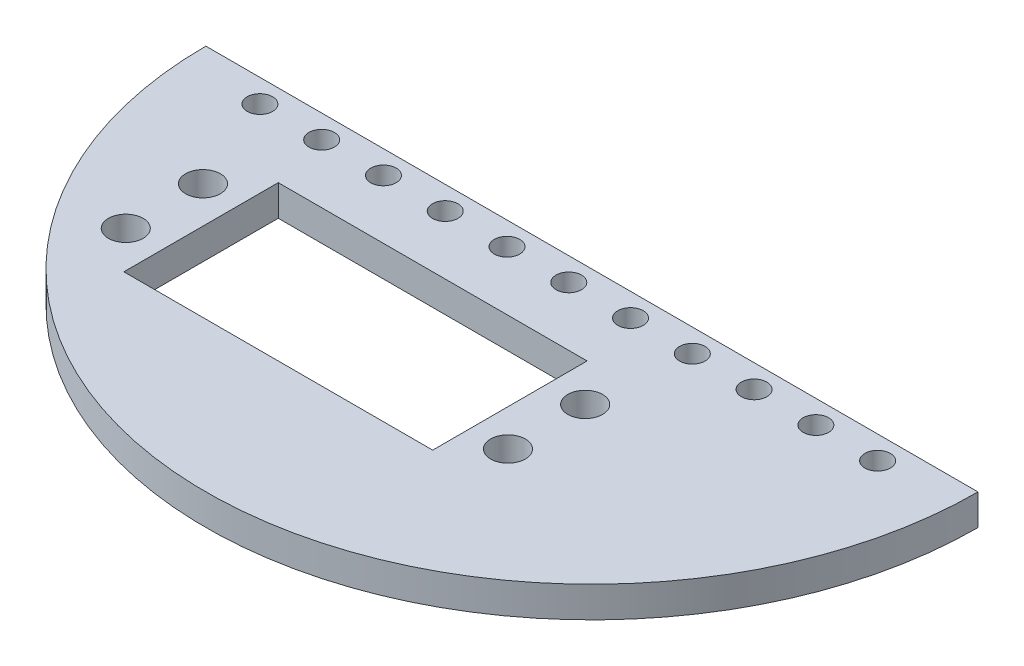
ISO-10303-21;
HEADER;
FILE_DESCRIPTION(('STEP AP214'),'2;1');
FILE_NAME('part.step','',(''),(''),'','','');
FILE_SCHEMA(('AUTOMOTIVE_DESIGN { 1 0 10303 214 1 1 1 1 }'));
ENDSEC;
DATA;
#1=APPLICATION_CONTEXT('core data for automotive mechanical design processes');
#2=APPLICATION_PROTOCOL_DEFINITION('international standard','automotive_design',2000,#1);
#3=PRODUCT_CONTEXT('',#1,'mechanical');
#4=PRODUCT('Part','Part','',(#3));
#5=PRODUCT_RELATED_PRODUCT_CATEGORY('part','',(#4));
#6=PRODUCT_DEFINITION_FORMATION('','',#4);
#7=PRODUCT_DEFINITION_CONTEXT('part definition',#1,'design');
#8=PRODUCT_DEFINITION('design','',#6,#7);
#9=PRODUCT_DEFINITION_SHAPE('','',#8);
#10=(LENGTH_UNIT() NAMED_UNIT(*) SI_UNIT(.MILLI.,.METRE.));
#11=(NAMED_UNIT(*) PLANE_ANGLE_UNIT() SI_UNIT($,.RADIAN.));
#12=(NAMED_UNIT(*) SI_UNIT($,.STERADIAN.) SOLID_ANGLE_UNIT());
#13=UNCERTAINTY_MEASURE_WITH_UNIT(LENGTH_MEASURE(1.E-05),#10,'distance_accuracy_value','');
#14=(GEOMETRIC_REPRESENTATION_CONTEXT(3) GLOBAL_UNCERTAINTY_ASSIGNED_CONTEXT((#13)) GLOBAL_UNIT_ASSIGNED_CONTEXT((#10,
#11,#12)) REPRESENTATION_CONTEXT('',''));
#15=CARTESIAN_POINT('',(0.,0.,0.));
#16=DIRECTION('',(0.,0.,1.));
#17=DIRECTION('',(1.,0.,0.));
#18=AXIS2_PLACEMENT_3D('',#15,#16,#17);
#19=CARTESIAN_POINT('',(0.,4.,0.));
#20=DIRECTION('',(0.,-1.,0.));
#21=DIRECTION('',(0.,0.,-1.));
#22=AXIS2_PLACEMENT_3D('',#19,#20,#21);
#23=CYLINDRICAL_SURFACE('',#22,50.);
#24=CARTESIAN_POINT('',(0.,0.,0.));
#25=DIRECTION('',(0.,1.,0.));
#26=DIRECTION('',(0.,0.,-1.));
#27=AXIS2_PLACEMENT_3D('',#24,#25,#26);
#28=CIRCLE('',#27,50.);
#29=CARTESIAN_POINT('',(-50.,0.,0.));
#30=VERTEX_POINT('',#29);
#31=CARTESIAN_POINT('',(50.,0.,0.));
#32=VERTEX_POINT('',#31);
#33=EDGE_CURVE('E126',#30,#32,#28,.T.);
#34=ORIENTED_EDGE('',*,*,#33,.T.);
#35=DIRECTION('',(0.,-1.,0.));
#36=VECTOR('',#35,1.);
#37=CARTESIAN_POINT('',(50.,4.,0.));
#38=LINE('',#37,#36);
#39=CARTESIAN_POINT('',(50.,4.,0.));
#40=VERTEX_POINT('',#39);
#41=EDGE_CURVE('E148',#40,#32,#38,.T.);
#42=ORIENTED_EDGE('',*,*,#41,.F.);
#43=CARTESIAN_POINT('',(0.,4.,0.));
#44=DIRECTION('',(0.,1.,0.));
#45=DIRECTION('',(0.,0.,-1.));
#46=AXIS2_PLACEMENT_3D('',#43,#44,#45);
#47=CIRCLE('',#46,50.);
#48=CARTESIAN_POINT('',(-50.,4.,0.));
#49=VERTEX_POINT('',#48);
#50=EDGE_CURVE('E131',#49,#40,#47,.T.);
#51=ORIENTED_EDGE('',*,*,#50,.F.);
#52=DIRECTION('',(0.,-1.,0.));
#53=VECTOR('',#52,1.);
#54=CARTESIAN_POINT('',(-50.,4.,0.));
#55=LINE('',#54,#53);
#56=EDGE_CURVE('E139',#49,#30,#55,.T.);
#57=ORIENTED_EDGE('',*,*,#56,.T.);
#58=EDGE_LOOP('',(#34,#42,#51,#57));
#59=FACE_BOUND('',#58,.T.);
#60=ADVANCED_FACE('F38',(#59),#23,.T.);
#61=CARTESIAN_POINT('',(-50.,4.,0.));
#62=DIRECTION('',(0.,0.,1.));
#63=DIRECTION('',(1.,0.,0.));
#64=AXIS2_PLACEMENT_3D('',#61,#62,#63);
#65=PLANE('',#64);
#66=DIRECTION('',(-1.,0.,0.));
#67=VECTOR('',#66,1.);
#68=CARTESIAN_POINT('',(-50.,0.,0.));
#69=LINE('',#68,#67);
#70=EDGE_CURVE('E136',#32,#30,#69,.T.);
#71=ORIENTED_EDGE('',*,*,#70,.T.);
#72=ORIENTED_EDGE('',*,*,#56,.F.);
#73=DIRECTION('',(-1.,0.,0.));
#74=VECTOR('',#73,1.);
#75=CARTESIAN_POINT('',(-50.,4.,0.));
#76=LINE('',#75,#74);
#77=EDGE_CURVE('E135',#40,#49,#76,.T.);
#78=ORIENTED_EDGE('',*,*,#77,.F.);
#79=ORIENTED_EDGE('',*,*,#41,.T.);
#80=EDGE_LOOP('',(#71,#72,#78,#79));
#81=FACE_BOUND('',#80,.T.);
#82=ADVANCED_FACE('F290',(#81),#65,.F.);
#83=CARTESIAN_POINT('',(0.,4.,0.));
#84=DIRECTION('',(0.,-1.,0.));
#85=DIRECTION('',(0.,0.,-1.));
#86=AXIS2_PLACEMENT_3D('',#83,#84,#85);
#87=PLANE('',#86);
#88=CARTESIAN_POINT('',(-24.,4.,3.00000000000001));
#89=DIRECTION('',(0.,1.,0.));
#90=DIRECTION('',(0.,0.,-1.));
#91=AXIS2_PLACEMENT_3D('',#88,#89,#90);
#92=CIRCLE('',#91,1.65);
#93=CARTESIAN_POINT('',(-24.,4.,1.35000000000001));
#94=VERTEX_POINT('',#93);
#95=EDGE_CURVE('E261',#94,#94,#92,.T.);
#96=ORIENTED_EDGE('',*,*,#95,.F.);
#97=EDGE_LOOP('',(#96));
#98=FACE_BOUND('',#97,.T.);
#99=CARTESIAN_POINT('',(-32.,4.,3.00000000000002));
#100=DIRECTION('',(0.,1.,0.));
#101=DIRECTION('',(0.,0.,-1.));
#102=AXIS2_PLACEMENT_3D('',#99,#100,#101);
#103=CIRCLE('',#102,1.65);
#104=CARTESIAN_POINT('',(-32.,4.,1.35000000000001));
#105=VERTEX_POINT('',#104);
#106=EDGE_CURVE('E265',#105,#105,#103,.T.);
#107=ORIENTED_EDGE('',*,*,#106,.F.);
#108=EDGE_LOOP('',(#107));
#109=FACE_BOUND('',#108,.T.);
#110=CARTESIAN_POINT('',(40.,4.,3.00000000000001));
#111=DIRECTION('',(0.,1.,0.));
#112=DIRECTION('',(0.,0.,1.));
#113=AXIS2_PLACEMENT_3D('',#110,#111,#112);
#114=CIRCLE('',#113,1.65);
#115=CARTESIAN_POINT('',(40.,4.,4.65000000000001));
#116=VERTEX_POINT('',#115);
#117=EDGE_CURVE('E270',#116,#116,#114,.T.);
#118=ORIENTED_EDGE('',*,*,#117,.F.);
#119=EDGE_LOOP('',(#118));
#120=FACE_BOUND('',#119,.T.);
#121=CARTESIAN_POINT('',(32.,4.,3.00000000000001));
#122=DIRECTION('',(0.,1.,0.));
#123=DIRECTION('',(0.,0.,1.));
#124=AXIS2_PLACEMENT_3D('',#121,#122,#123);
#125=CIRCLE('',#124,1.65);
#126=CARTESIAN_POINT('',(32.,4.,4.65000000000001));
#127=VERTEX_POINT('',#126);
#128=EDGE_CURVE('E250',#127,#127,#125,.T.);
#129=ORIENTED_EDGE('',*,*,#128,.F.);
#130=EDGE_LOOP('',(#129));
#131=FACE_BOUND('',#130,.T.);
#132=CARTESIAN_POINT('',(24.,4.,3.00000000000001));
#133=DIRECTION('',(0.,1.,0.));
#134=DIRECTION('',(0.,0.,1.));
#135=AXIS2_PLACEMENT_3D('',#132,#133,#134);
#136=CIRCLE('',#135,1.65);
#137=CARTESIAN_POINT('',(24.,4.,4.65000000000001));
#138=VERTEX_POINT('',#137);
#139=EDGE_CURVE('E245',#138,#138,#136,.T.);
#140=ORIENTED_EDGE('',*,*,#139,.F.);
#141=EDGE_LOOP('',(#140));
#142=FACE_BOUND('',#141,.T.);
#143=CARTESIAN_POINT('',(16.,4.,3.00000000000001));
#144=DIRECTION('',(0.,1.,0.));
#145=DIRECTION('',(0.,0.,1.));
#146=AXIS2_PLACEMENT_3D('',#143,#144,#145);
#147=CIRCLE('',#146,1.65);
#148=CARTESIAN_POINT('',(16.,4.,4.65000000000001));
#149=VERTEX_POINT('',#148);
#150=EDGE_CURVE('E249',#149,#149,#147,.T.);
#151=ORIENTED_EDGE('',*,*,#150,.F.);
#152=EDGE_LOOP('',(#151));
#153=FACE_BOUND('',#152,.T.);
#154=CARTESIAN_POINT('',(8.,4.,3.00000000000001));
#155=DIRECTION('',(0.,1.,0.));
#156=DIRECTION('',(0.,0.,1.));
#157=AXIS2_PLACEMENT_3D('',#154,#155,#156);
#158=CIRCLE('',#157,1.65);
#159=CARTESIAN_POINT('',(8.,4.,4.65000000000001));
#160=VERTEX_POINT('',#159);
#161=EDGE_CURVE('E254',#160,#160,#158,.T.);
#162=ORIENTED_EDGE('',*,*,#161,.F.);
#163=EDGE_LOOP('',(#162));
#164=FACE_BOUND('',#163,.T.);
#165=CARTESIAN_POINT('',(-40.,4.,3.00000000000002));
#166=DIRECTION('',(0.,1.,0.));
#167=DIRECTION('',(0.,0.,-1.));
#168=AXIS2_PLACEMENT_3D('',#165,#166,#167);
#169=CIRCLE('',#168,1.65);
#170=CARTESIAN_POINT('',(-40.,4.,1.35000000000001));
#171=VERTEX_POINT('',#170);
#172=EDGE_CURVE('E244',#171,#171,#169,.T.);
#173=ORIENTED_EDGE('',*,*,#172,.F.);
#174=EDGE_LOOP('',(#173));
#175=FACE_BOUND('',#174,.T.);
#176=CARTESIAN_POINT('',(-16.,4.,3.00000000000001));
#177=DIRECTION('',(0.,1.,0.));
#178=DIRECTION('',(0.,0.,-1.));
#179=AXIS2_PLACEMENT_3D('',#176,#177,#178);
#180=CIRCLE('',#179,1.65);
#181=CARTESIAN_POINT('',(-16.,4.,1.35000000000001));
#182=VERTEX_POINT('',#181);
#183=EDGE_CURVE('E266',#182,#182,#180,.T.);
#184=ORIENTED_EDGE('',*,*,#183,.F.);
#185=EDGE_LOOP('',(#184));
#186=FACE_BOUND('',#185,.T.);
#187=CARTESIAN_POINT('',(-8.,4.,3.00000000000001));
#188=DIRECTION('',(0.,1.,0.));
#189=DIRECTION('',(0.,0.,-1.));
#190=AXIS2_PLACEMENT_3D('',#187,#188,#189);
#191=CIRCLE('',#190,1.65);
#192=CARTESIAN_POINT('',(-8.,4.,1.35000000000001));
#193=VERTEX_POINT('',#192);
#194=EDGE_CURVE('E277',#193,#193,#191,.T.);
#195=ORIENTED_EDGE('',*,*,#194,.F.);
#196=EDGE_LOOP('',(#195));
#197=FACE_BOUND('',#196,.T.);
#198=CARTESIAN_POINT('',(0.,4.,3.00000000000001));
#199=DIRECTION('',(0.,1.,0.));
#200=DIRECTION('',(0.,0.,1.));
#201=AXIS2_PLACEMENT_3D('',#198,#199,#200);
#202=CIRCLE('',#201,1.65);
#203=CARTESIAN_POINT('',(0.,4.,4.65000000000001));
#204=VERTEX_POINT('',#203);
#205=EDGE_CURVE('E180',#204,#204,#202,.T.);
#206=ORIENTED_EDGE('',*,*,#205,.F.);
#207=EDGE_LOOP('',(#206));
#208=FACE_BOUND('',#207,.T.);
#209=CARTESIAN_POINT('',(14.75,4.,15.6230438879649));
#210=DIRECTION('',(0.,1.,0.));
#211=DIRECTION('',(0.,0.,-1.));
#212=AXIS2_PLACEMENT_3D('',#209,#210,#211);
#213=CIRCLE('',#212,2.25);
#214=CARTESIAN_POINT('',(14.75,4.,13.3730438879649));
#215=VERTEX_POINT('',#214);
#216=EDGE_CURVE('E218',#215,#215,#213,.T.);
#217=ORIENTED_EDGE('',*,*,#216,.F.);
#218=EDGE_LOOP('',(#217));
#219=FACE_BOUND('',#218,.T.);
#220=CARTESIAN_POINT('',(14.75,4.,25.6230438879649));
#221=DIRECTION('',(0.,1.,0.));
#222=DIRECTION('',(0.,0.,-1.));
#223=AXIS2_PLACEMENT_3D('',#220,#221,#222);
#224=CIRCLE('',#223,2.25);
#225=CARTESIAN_POINT('',(14.75,4.,23.3730438879649));
#226=VERTEX_POINT('',#225);
#227=EDGE_CURVE('E223',#226,#226,#224,.T.);
#228=ORIENTED_EDGE('',*,*,#227,.F.);
#229=EDGE_LOOP('',(#228));
#230=FACE_BOUND('',#229,.T.);
#231=CARTESIAN_POINT('',(-34.75,4.,25.623043887965));
#232=DIRECTION('',(0.,1.,0.));
#233=DIRECTION('',(0.,0.,1.));
#234=AXIS2_PLACEMENT_3D('',#231,#232,#233);
#235=CIRCLE('',#234,2.25);
#236=CARTESIAN_POINT('',(-34.75,4.,27.873043887965));
#237=VERTEX_POINT('',#236);
#238=EDGE_CURVE('E229',#237,#237,#235,.T.);
#239=ORIENTED_EDGE('',*,*,#238,.F.);
#240=EDGE_LOOP('',(#239));
#241=FACE_BOUND('',#240,.T.);
#242=CARTESIAN_POINT('',(-34.75,4.,15.6230438879649));
#243=DIRECTION('',(0.,1.,0.));
#244=DIRECTION('',(0.,0.,1.));
#245=AXIS2_PLACEMENT_3D('',#242,#243,#244);
#246=CIRCLE('',#245,2.25);
#247=CARTESIAN_POINT('',(-34.75,4.,17.873043887965));
#248=VERTEX_POINT('',#247);
#249=EDGE_CURVE('E164',#248,#248,#246,.T.);
#250=ORIENTED_EDGE('',*,*,#249,.F.);
#251=EDGE_LOOP('',(#250));
#252=FACE_BOUND('',#251,.T.);
#253=DIRECTION('',(0.,0.,1.));
#254=VECTOR('',#253,1.);
#255=CARTESIAN_POINT('',(-30.,4.,30.623043887965));
#256=LINE('',#255,#254);
#257=CARTESIAN_POINT('',(-30.,4.,10.6230438879649));
#258=VERTEX_POINT('',#257);
#259=CARTESIAN_POINT('',(-30.,4.,30.623043887965));
#260=VERTEX_POINT('',#259);
#261=EDGE_CURVE('E105',#258,#260,#256,.T.);
#262=ORIENTED_EDGE('',*,*,#261,.F.);
#263=DIRECTION('',(-1.,0.,0.));
#264=VECTOR('',#263,1.);
#265=CARTESIAN_POINT('',(0.,4.,10.6230438879649));
#266=LINE('',#265,#264);
#267=CARTESIAN_POINT('',(10.,4.,10.6230438879649));
#268=VERTEX_POINT('',#267);
#269=EDGE_CURVE('E55',#268,#258,#266,.T.);
#270=ORIENTED_EDGE('',*,*,#269,.F.);
#271=DIRECTION('',(0.,0.,-1.));
#272=VECTOR('',#271,1.);
#273=CARTESIAN_POINT('',(10.,4.,10.6230438879649));
#274=LINE('',#273,#272);
#275=CARTESIAN_POINT('',(10.,4.,30.6230438879649));
#276=VERTEX_POINT('',#275);
#277=EDGE_CURVE('E114',#276,#268,#274,.T.);
#278=ORIENTED_EDGE('',*,*,#277,.F.);
#279=DIRECTION('',(1.,0.,0.));
#280=VECTOR('',#279,1.);
#281=CARTESIAN_POINT('',(10.,4.,30.6230438879649));
#282=LINE('',#281,#280);
#283=EDGE_CURVE('E95',#260,#276,#282,.T.);
#284=ORIENTED_EDGE('',*,*,#283,.F.);
#285=EDGE_LOOP('',(#262,#270,#278,#284));
#286=FACE_BOUND('',#285,.T.);
#287=ORIENTED_EDGE('',*,*,#50,.T.);
#288=ORIENTED_EDGE('',*,*,#77,.T.);
#289=EDGE_LOOP('',(#287,#288));
#290=FACE_BOUND('',#289,.T.);
#291=ADVANCED_FACE('F111',(#98,#109,#120,#131,#142,#153,#164,#175,#186,#197,#208,#219,#230,#241,
#252,#286,#290),#87,.F.);
#292=CARTESIAN_POINT('',(0.,0.,0.));
#293=DIRECTION('',(0.,-1.,0.));
#294=DIRECTION('',(0.,0.,-1.));
#295=AXIS2_PLACEMENT_3D('',#292,#293,#294);
#296=PLANE('',#295);
#297=CARTESIAN_POINT('',(-24.,0.,3.00000000000001));
#298=DIRECTION('',(0.,-1.,0.));
#299=DIRECTION('',(0.,0.,-1.));
#300=AXIS2_PLACEMENT_3D('',#297,#298,#299);
#301=CIRCLE('',#300,1.65);
#302=CARTESIAN_POINT('',(-24.,0.,1.35000000000001));
#303=VERTEX_POINT('',#302);
#304=EDGE_CURVE('E41',#303,#303,#301,.T.);
#305=ORIENTED_EDGE('',*,*,#304,.F.);
#306=EDGE_LOOP('',(#305));
#307=FACE_BOUND('',#306,.T.);
#308=CARTESIAN_POINT('',(-32.,0.,3.00000000000002));
#309=DIRECTION('',(0.,-1.,0.));
#310=DIRECTION('',(0.,0.,-1.));
#311=AXIS2_PLACEMENT_3D('',#308,#309,#310);
#312=CIRCLE('',#311,1.65);
#313=CARTESIAN_POINT('',(-32.,0.,1.35000000000001));
#314=VERTEX_POINT('',#313);
#315=EDGE_CURVE('E211',#314,#314,#312,.T.);
#316=ORIENTED_EDGE('',*,*,#315,.F.);
#317=EDGE_LOOP('',(#316));
#318=FACE_BOUND('',#317,.T.);
#319=CARTESIAN_POINT('',(40.,0.,3.00000000000001));
#320=DIRECTION('',(0.,-1.,0.));
#321=DIRECTION('',(0.,0.,-1.));
#322=AXIS2_PLACEMENT_3D('',#319,#320,#321);
#323=CIRCLE('',#322,1.65);
#324=CARTESIAN_POINT('',(40.,0.,1.35000000000001));
#325=VERTEX_POINT('',#324);
#326=EDGE_CURVE('E208',#325,#325,#323,.T.);
#327=ORIENTED_EDGE('',*,*,#326,.F.);
#328=EDGE_LOOP('',(#327));
#329=FACE_BOUND('',#328,.T.);
#330=CARTESIAN_POINT('',(32.,0.,3.00000000000001));
#331=DIRECTION('',(0.,-1.,0.));
#332=DIRECTION('',(0.,0.,-1.));
#333=AXIS2_PLACEMENT_3D('',#330,#331,#332);
#334=CIRCLE('',#333,1.65);
#335=CARTESIAN_POINT('',(32.,0.,1.35000000000001));
#336=VERTEX_POINT('',#335);
#337=EDGE_CURVE('E204',#336,#336,#334,.T.);
#338=ORIENTED_EDGE('',*,*,#337,.F.);
#339=EDGE_LOOP('',(#338));
#340=FACE_BOUND('',#339,.T.);
#341=CARTESIAN_POINT('',(24.,0.,3.00000000000001));
#342=DIRECTION('',(0.,-1.,0.));
#343=DIRECTION('',(0.,0.,-1.));
#344=AXIS2_PLACEMENT_3D('',#341,#342,#343);
#345=CIRCLE('',#344,1.65);
#346=CARTESIAN_POINT('',(24.,0.,1.35000000000001));
#347=VERTEX_POINT('',#346);
#348=EDGE_CURVE('E200',#347,#347,#345,.T.);
#349=ORIENTED_EDGE('',*,*,#348,.F.);
#350=EDGE_LOOP('',(#349));
#351=FACE_BOUND('',#350,.T.);
#352=CARTESIAN_POINT('',(16.,0.,3.00000000000001));
#353=DIRECTION('',(0.,-1.,0.));
#354=DIRECTION('',(0.,0.,-1.));
#355=AXIS2_PLACEMENT_3D('',#352,#353,#354);
#356=CIRCLE('',#355,1.65);
#357=CARTESIAN_POINT('',(16.,0.,1.35000000000001));
#358=VERTEX_POINT('',#357);
#359=EDGE_CURVE('E196',#358,#358,#356,.T.);
#360=ORIENTED_EDGE('',*,*,#359,.F.);
#361=EDGE_LOOP('',(#360));
#362=FACE_BOUND('',#361,.T.);
#363=CARTESIAN_POINT('',(8.,0.,3.00000000000001));
#364=DIRECTION('',(0.,-1.,0.));
#365=DIRECTION('',(0.,0.,-1.));
#366=AXIS2_PLACEMENT_3D('',#363,#364,#365);
#367=CIRCLE('',#366,1.65);
#368=CARTESIAN_POINT('',(8.,0.,1.35000000000001));
#369=VERTEX_POINT('',#368);
#370=EDGE_CURVE('E192',#369,#369,#367,.T.);
#371=ORIENTED_EDGE('',*,*,#370,.F.);
#372=EDGE_LOOP('',(#371));
#373=FACE_BOUND('',#372,.T.);
#374=CARTESIAN_POINT('',(-40.,0.,3.00000000000002));
#375=DIRECTION('',(0.,-1.,0.));
#376=DIRECTION('',(0.,0.,-1.));
#377=AXIS2_PLACEMENT_3D('',#374,#375,#376);
#378=CIRCLE('',#377,1.65);
#379=CARTESIAN_POINT('',(-40.,0.,1.35000000000001));
#380=VERTEX_POINT('',#379);
#381=EDGE_CURVE('E188',#380,#380,#378,.T.);
#382=ORIENTED_EDGE('',*,*,#381,.F.);
#383=EDGE_LOOP('',(#382));
#384=FACE_BOUND('',#383,.T.);
#385=CARTESIAN_POINT('',(-16.,0.,3.00000000000001));
#386=DIRECTION('',(0.,-1.,0.));
#387=DIRECTION('',(0.,0.,-1.));
#388=AXIS2_PLACEMENT_3D('',#385,#386,#387);
#389=CIRCLE('',#388,1.65);
#390=CARTESIAN_POINT('',(-16.,0.,1.35000000000001));
#391=VERTEX_POINT('',#390);
#392=EDGE_CURVE('E184',#391,#391,#389,.T.);
#393=ORIENTED_EDGE('',*,*,#392,.F.);
#394=EDGE_LOOP('',(#393));
#395=FACE_BOUND('',#394,.T.);
#396=CARTESIAN_POINT('',(-8.,0.,3.00000000000001));
#397=DIRECTION('',(0.,-1.,0.));
#398=DIRECTION('',(0.,0.,-1.));
#399=AXIS2_PLACEMENT_3D('',#396,#397,#398);
#400=CIRCLE('',#399,1.65);
#401=CARTESIAN_POINT('',(-8.,0.,1.35000000000001));
#402=VERTEX_POINT('',#401);
#403=EDGE_CURVE('E179',#402,#402,#400,.T.);
#404=ORIENTED_EDGE('',*,*,#403,.F.);
#405=EDGE_LOOP('',(#404));
#406=FACE_BOUND('',#405,.T.);
#407=CARTESIAN_POINT('',(0.,0.,3.00000000000001));
#408=DIRECTION('',(0.,-1.,0.));
#409=DIRECTION('',(0.,0.,-1.));
#410=AXIS2_PLACEMENT_3D('',#407,#408,#409);
#411=CIRCLE('',#410,1.65);
#412=CARTESIAN_POINT('',(0.,0.,1.35000000000001));
#413=VERTEX_POINT('',#412);
#414=EDGE_CURVE('E175',#413,#413,#411,.T.);
#415=ORIENTED_EDGE('',*,*,#414,.F.);
#416=EDGE_LOOP('',(#415));
#417=FACE_BOUND('',#416,.T.);
#418=CARTESIAN_POINT('',(14.75,0.,15.6230438879649));
#419=DIRECTION('',(0.,-1.,0.));
#420=DIRECTION('',(0.,0.,-1.));
#421=AXIS2_PLACEMENT_3D('',#418,#419,#420);
#422=CIRCLE('',#421,2.25);
#423=CARTESIAN_POINT('',(14.75,0.,13.3730438879649));
#424=VERTEX_POINT('',#423);
#425=EDGE_CURVE('E109',#424,#424,#422,.T.);
#426=ORIENTED_EDGE('',*,*,#425,.F.);
#427=EDGE_LOOP('',(#426));
#428=FACE_BOUND('',#427,.T.);
#429=CARTESIAN_POINT('',(14.75,0.,25.6230438879649));
#430=DIRECTION('',(0.,-1.,0.));
#431=DIRECTION('',(0.,0.,-1.));
#432=AXIS2_PLACEMENT_3D('',#429,#430,#431);
#433=CIRCLE('',#432,2.25);
#434=CARTESIAN_POINT('',(14.75,0.,23.3730438879649));
#435=VERTEX_POINT('',#434);
#436=EDGE_CURVE('E168',#435,#435,#433,.T.);
#437=ORIENTED_EDGE('',*,*,#436,.F.);
#438=EDGE_LOOP('',(#437));
#439=FACE_BOUND('',#438,.T.);
#440=CARTESIAN_POINT('',(-34.75,0.,25.623043887965));
#441=DIRECTION('',(0.,-1.,0.));
#442=DIRECTION('',(0.,0.,-1.));
#443=AXIS2_PLACEMENT_3D('',#440,#441,#442);
#444=CIRCLE('',#443,2.25);
#445=CARTESIAN_POINT('',(-34.75,0.,23.3730438879649));
#446=VERTEX_POINT('',#445);
#447=EDGE_CURVE('E163',#446,#446,#444,.T.);
#448=ORIENTED_EDGE('',*,*,#447,.F.);
#449=EDGE_LOOP('',(#448));
#450=FACE_BOUND('',#449,.T.);
#451=CARTESIAN_POINT('',(-34.75,0.,15.6230438879649));
#452=DIRECTION('',(0.,-1.,0.));
#453=DIRECTION('',(0.,0.,-1.));
#454=AXIS2_PLACEMENT_3D('',#451,#452,#453);
#455=CIRCLE('',#454,2.25);
#456=CARTESIAN_POINT('',(-34.75,0.,13.3730438879649));
#457=VERTEX_POINT('',#456);
#458=EDGE_CURVE('E159',#457,#457,#455,.T.);
#459=ORIENTED_EDGE('',*,*,#458,.F.);
#460=EDGE_LOOP('',(#459));
#461=FACE_BOUND('',#460,.T.);
#462=DIRECTION('',(1.,0.,0.));
#463=VECTOR('',#462,1.);
#464=CARTESIAN_POINT('',(0.,0.,10.6230438879649));
#465=LINE('',#464,#463);
#466=CARTESIAN_POINT('',(-30.,0.,10.6230438879649));
#467=VERTEX_POINT('',#466);
#468=CARTESIAN_POINT('',(10.,0.,10.6230438879649));
#469=VERTEX_POINT('',#468);
#470=EDGE_CURVE('E11',#467,#469,#465,.T.);
#471=ORIENTED_EDGE('',*,*,#470,.F.);
#472=DIRECTION('',(0.,0.,-1.));
#473=VECTOR('',#472,1.);
#474=CARTESIAN_POINT('',(-30.,0.,0.));
#475=LINE('',#474,#473);
#476=CARTESIAN_POINT('',(-30.,0.,30.623043887965));
#477=VERTEX_POINT('',#476);
#478=EDGE_CURVE('E152',#477,#467,#475,.T.);
#479=ORIENTED_EDGE('',*,*,#478,.F.);
#480=DIRECTION('',(-1.,0.,0.));
#481=VECTOR('',#480,1.);
#482=CARTESIAN_POINT('',(0.,0.,30.6230438879649));
#483=LINE('',#482,#481);
#484=CARTESIAN_POINT('',(10.,0.,30.6230438879649));
#485=VERTEX_POINT('',#484);
#486=EDGE_CURVE('E98',#485,#477,#483,.T.);
#487=ORIENTED_EDGE('',*,*,#486,.F.);
#488=DIRECTION('',(0.,0.,1.));
#489=VECTOR('',#488,1.);
#490=CARTESIAN_POINT('',(10.,0.,0.));
#491=LINE('',#490,#489);
#492=EDGE_CURVE('E47',#469,#485,#491,.T.);
#493=ORIENTED_EDGE('',*,*,#492,.F.);
#494=EDGE_LOOP('',(#471,#479,#487,#493));
#495=FACE_BOUND('',#494,.T.);
#496=ORIENTED_EDGE('',*,*,#33,.F.);
#497=ORIENTED_EDGE('',*,*,#70,.F.);
#498=EDGE_LOOP('',(#496,#497));
#499=FACE_BOUND('',#498,.T.);
#500=ADVANCED_FACE('F289',(#307,#318,#329,#340,#351,#362,#373,#384,#395,#406,#417,#428,#439,
#450,#461,#495,#499),#296,.T.);
#501=CARTESIAN_POINT('',(0.,-6.,10.6230438879649));
#502=DIRECTION('',(0.,0.,-1.));
#503=DIRECTION('',(-1.,0.,0.));
#504=AXIS2_PLACEMENT_3D('',#501,#502,#503);
#505=PLANE('',#504);
#506=ORIENTED_EDGE('',*,*,#470,.T.);
#507=DIRECTION('',(0.,1.,0.));
#508=VECTOR('',#507,1.);
#509=CARTESIAN_POINT('',(10.,-6.,10.6230438879649));
#510=LINE('',#509,#508);
#511=EDGE_CURVE('E123',#469,#268,#510,.T.);
#512=ORIENTED_EDGE('',*,*,#511,.T.);
#513=ORIENTED_EDGE('',*,*,#269,.T.);
#514=DIRECTION('',(0.,1.,0.));
#515=VECTOR('',#514,1.);
#516=CARTESIAN_POINT('',(-30.,-6.,10.6230438879649));
#517=LINE('',#516,#515);
#518=EDGE_CURVE('E102',#467,#258,#517,.T.);
#519=ORIENTED_EDGE('',*,*,#518,.F.);
#520=EDGE_LOOP('',(#506,#512,#513,#519));
#521=FACE_BOUND('',#520,.T.);
#522=ADVANCED_FACE('F330',(#521),#505,.F.);
#523=CARTESIAN_POINT('',(10.,-6.,10.6230438879649));
#524=DIRECTION('',(1.,0.,0.));
#525=DIRECTION('',(0.,0.,-1.));
#526=AXIS2_PLACEMENT_3D('',#523,#524,#525);
#527=PLANE('',#526);
#528=ORIENTED_EDGE('',*,*,#492,.T.);
#529=DIRECTION('',(0.,1.,0.));
#530=VECTOR('',#529,1.);
#531=CARTESIAN_POINT('',(10.,-6.,30.6230438879649));
#532=LINE('',#531,#530);
#533=EDGE_CURVE('E101',#485,#276,#532,.T.);
#534=ORIENTED_EDGE('',*,*,#533,.T.);
#535=ORIENTED_EDGE('',*,*,#277,.T.);
#536=ORIENTED_EDGE('',*,*,#511,.F.);
#537=EDGE_LOOP('',(#528,#534,#535,#536));
#538=FACE_BOUND('',#537,.T.);
#539=ADVANCED_FACE('F336',(#538),#527,.F.);
#540=CARTESIAN_POINT('',(10.,-6.,30.6230438879649));
#541=DIRECTION('',(0.,0.,1.));
#542=DIRECTION('',(1.,0.,0.));
#543=AXIS2_PLACEMENT_3D('',#540,#541,#542);
#544=PLANE('',#543);
#545=ORIENTED_EDGE('',*,*,#486,.T.);
#546=DIRECTION('',(0.,1.,0.));
#547=VECTOR('',#546,1.);
#548=CARTESIAN_POINT('',(-30.,-6.,30.623043887965));
#549=LINE('',#548,#547);
#550=EDGE_CURVE('E63',#477,#260,#549,.T.);
#551=ORIENTED_EDGE('',*,*,#550,.T.);
#552=ORIENTED_EDGE('',*,*,#283,.T.);
#553=ORIENTED_EDGE('',*,*,#533,.F.);
#554=EDGE_LOOP('',(#545,#551,#552,#553));
#555=FACE_BOUND('',#554,.T.);
#556=ADVANCED_FACE('F92',(#555),#544,.F.);
#557=CARTESIAN_POINT('',(-30.,-6.,30.623043887965));
#558=DIRECTION('',(-1.,0.,0.));
#559=DIRECTION('',(0.,0.,1.));
#560=AXIS2_PLACEMENT_3D('',#557,#558,#559);
#561=PLANE('',#560);
#562=ORIENTED_EDGE('',*,*,#478,.T.);
#563=ORIENTED_EDGE('',*,*,#518,.T.);
#564=ORIENTED_EDGE('',*,*,#261,.T.);
#565=ORIENTED_EDGE('',*,*,#550,.F.);
#566=EDGE_LOOP('',(#562,#563,#564,#565));
#567=FACE_BOUND('',#566,.T.);
#568=ADVANCED_FACE('F106',(#567),#561,.F.);
#569=CARTESIAN_POINT('',(-34.75,-6.,15.6230438879649));
#570=DIRECTION('',(0.,1.,0.));
#571=DIRECTION('',(0.,0.,1.));
#572=AXIS2_PLACEMENT_3D('',#569,#570,#571);
#573=CYLINDRICAL_SURFACE('',#572,2.25);
#574=ORIENTED_EDGE('',*,*,#458,.T.);
#575=EDGE_LOOP('',(#574));
#576=FACE_BOUND('',#575,.T.);
#577=ORIENTED_EDGE('',*,*,#249,.T.);
#578=EDGE_LOOP('',(#577));
#579=FACE_BOUND('',#578,.T.);
#580=ADVANCED_FACE('F315',(#576,#579),#573,.F.);
#581=CARTESIAN_POINT('',(-34.75,-6.,25.623043887965));
#582=DIRECTION('',(0.,1.,0.));
#583=DIRECTION('',(0.,0.,1.));
#584=AXIS2_PLACEMENT_3D('',#581,#582,#583);
#585=CYLINDRICAL_SURFACE('',#584,2.25);
#586=ORIENTED_EDGE('',*,*,#447,.T.);
#587=EDGE_LOOP('',(#586));
#588=FACE_BOUND('',#587,.T.);
#589=ORIENTED_EDGE('',*,*,#238,.T.);
#590=EDGE_LOOP('',(#589));
#591=FACE_BOUND('',#590,.T.);
#592=ADVANCED_FACE('F305',(#588,#591),#585,.F.);
#593=CARTESIAN_POINT('',(14.75,-6.,25.6230438879649));
#594=DIRECTION('',(0.,1.,0.));
#595=DIRECTION('',(0.,0.,1.));
#596=AXIS2_PLACEMENT_3D('',#593,#594,#595);
#597=CYLINDRICAL_SURFACE('',#596,2.25);
#598=ORIENTED_EDGE('',*,*,#436,.T.);
#599=EDGE_LOOP('',(#598));
#600=FACE_BOUND('',#599,.T.);
#601=ORIENTED_EDGE('',*,*,#227,.T.);
#602=EDGE_LOOP('',(#601));
#603=FACE_BOUND('',#602,.T.);
#604=ADVANCED_FACE('F302',(#600,#603),#597,.F.);
#605=CARTESIAN_POINT('',(14.75,-6.,15.6230438879649));
#606=DIRECTION('',(0.,1.,0.));
#607=DIRECTION('',(0.,0.,1.));
#608=AXIS2_PLACEMENT_3D('',#605,#606,#607);
#609=CYLINDRICAL_SURFACE('',#608,2.25);
#610=ORIENTED_EDGE('',*,*,#425,.T.);
#611=EDGE_LOOP('',(#610));
#612=FACE_BOUND('',#611,.T.);
#613=ORIENTED_EDGE('',*,*,#216,.T.);
#614=EDGE_LOOP('',(#613));
#615=FACE_BOUND('',#614,.T.);
#616=ADVANCED_FACE('F304',(#612,#615),#609,.F.);
#617=CARTESIAN_POINT('',(0.,-6.,3.00000000000001));
#618=DIRECTION('',(0.,1.,0.));
#619=DIRECTION('',(0.,0.,1.));
#620=AXIS2_PLACEMENT_3D('',#617,#618,#619);
#621=CYLINDRICAL_SURFACE('',#620,1.65);
#622=ORIENTED_EDGE('',*,*,#414,.T.);
#623=EDGE_LOOP('',(#622));
#624=FACE_BOUND('',#623,.T.);
#625=ORIENTED_EDGE('',*,*,#205,.T.);
#626=EDGE_LOOP('',(#625));
#627=FACE_BOUND('',#626,.T.);
#628=ADVANCED_FACE('F312',(#624,#627),#621,.F.);
#629=CARTESIAN_POINT('',(-8.,-6.,3.00000000000001));
#630=DIRECTION('',(0.,1.,0.));
#631=DIRECTION('',(0.,0.,1.));
#632=AXIS2_PLACEMENT_3D('',#629,#630,#631);
#633=CYLINDRICAL_SURFACE('',#632,1.65);
#634=ORIENTED_EDGE('',*,*,#403,.T.);
#635=EDGE_LOOP('',(#634));
#636=FACE_BOUND('',#635,.T.);
#637=ORIENTED_EDGE('',*,*,#194,.T.);
#638=EDGE_LOOP('',(#637));
#639=FACE_BOUND('',#638,.T.);
#640=ADVANCED_FACE('F394',(#636,#639),#633,.F.);
#641=CARTESIAN_POINT('',(-16.,-6.,3.00000000000001));
#642=DIRECTION('',(0.,1.,0.));
#643=DIRECTION('',(0.,0.,1.));
#644=AXIS2_PLACEMENT_3D('',#641,#642,#643);
#645=CYLINDRICAL_SURFACE('',#644,1.65);
#646=ORIENTED_EDGE('',*,*,#392,.T.);
#647=EDGE_LOOP('',(#646));
#648=FACE_BOUND('',#647,.T.);
#649=ORIENTED_EDGE('',*,*,#183,.T.);
#650=EDGE_LOOP('',(#649));
#651=FACE_BOUND('',#650,.T.);
#652=ADVANCED_FACE('F285',(#648,#651),#645,.F.);
#653=CARTESIAN_POINT('',(-40.,-6.,3.00000000000002));
#654=DIRECTION('',(0.,1.,0.));
#655=DIRECTION('',(0.,0.,1.));
#656=AXIS2_PLACEMENT_3D('',#653,#654,#655);
#657=CYLINDRICAL_SURFACE('',#656,1.65);
#658=ORIENTED_EDGE('',*,*,#381,.T.);
#659=EDGE_LOOP('',(#658));
#660=FACE_BOUND('',#659,.T.);
#661=ORIENTED_EDGE('',*,*,#172,.T.);
#662=EDGE_LOOP('',(#661));
#663=FACE_BOUND('',#662,.T.);
#664=ADVANCED_FACE('F413',(#660,#663),#657,.F.);
#665=CARTESIAN_POINT('',(8.,-6.,3.00000000000001));
#666=DIRECTION('',(0.,1.,0.));
#667=DIRECTION('',(0.,0.,1.));
#668=AXIS2_PLACEMENT_3D('',#665,#666,#667);
#669=CYLINDRICAL_SURFACE('',#668,1.65);
#670=ORIENTED_EDGE('',*,*,#370,.T.);
#671=EDGE_LOOP('',(#670));
#672=FACE_BOUND('',#671,.T.);
#673=ORIENTED_EDGE('',*,*,#161,.T.);
#674=EDGE_LOOP('',(#673));
#675=FACE_BOUND('',#674,.T.);
#676=ADVANCED_FACE('F423',(#672,#675),#669,.F.);
#677=CARTESIAN_POINT('',(16.,-6.,3.00000000000001));
#678=DIRECTION('',(0.,1.,0.));
#679=DIRECTION('',(0.,0.,1.));
#680=AXIS2_PLACEMENT_3D('',#677,#678,#679);
#681=CYLINDRICAL_SURFACE('',#680,1.65);
#682=ORIENTED_EDGE('',*,*,#359,.T.);
#683=EDGE_LOOP('',(#682));
#684=FACE_BOUND('',#683,.T.);
#685=ORIENTED_EDGE('',*,*,#150,.T.);
#686=EDGE_LOOP('',(#685));
#687=FACE_BOUND('',#686,.T.);
#688=ADVANCED_FACE('F433',(#684,#687),#681,.F.);
#689=CARTESIAN_POINT('',(24.,-6.,3.00000000000001));
#690=DIRECTION('',(0.,1.,0.));
#691=DIRECTION('',(0.,0.,1.));
#692=AXIS2_PLACEMENT_3D('',#689,#690,#691);
#693=CYLINDRICAL_SURFACE('',#692,1.65);
#694=ORIENTED_EDGE('',*,*,#348,.T.);
#695=EDGE_LOOP('',(#694));
#696=FACE_BOUND('',#695,.T.);
#697=ORIENTED_EDGE('',*,*,#139,.T.);
#698=EDGE_LOOP('',(#697));
#699=FACE_BOUND('',#698,.T.);
#700=ADVANCED_FACE('F443',(#696,#699),#693,.F.);
#701=CARTESIAN_POINT('',(32.,-6.,3.00000000000001));
#702=DIRECTION('',(0.,1.,0.));
#703=DIRECTION('',(0.,0.,1.));
#704=AXIS2_PLACEMENT_3D('',#701,#702,#703);
#705=CYLINDRICAL_SURFACE('',#704,1.65);
#706=ORIENTED_EDGE('',*,*,#337,.T.);
#707=EDGE_LOOP('',(#706));
#708=FACE_BOUND('',#707,.T.);
#709=ORIENTED_EDGE('',*,*,#128,.T.);
#710=EDGE_LOOP('',(#709));
#711=FACE_BOUND('',#710,.T.);
#712=ADVANCED_FACE('F453',(#708,#711),#705,.F.);
#713=CARTESIAN_POINT('',(40.,-6.,3.00000000000001));
#714=DIRECTION('',(0.,1.,0.));
#715=DIRECTION('',(0.,0.,1.));
#716=AXIS2_PLACEMENT_3D('',#713,#714,#715);
#717=CYLINDRICAL_SURFACE('',#716,1.65);
#718=ORIENTED_EDGE('',*,*,#326,.T.);
#719=EDGE_LOOP('',(#718));
#720=FACE_BOUND('',#719,.T.);
#721=ORIENTED_EDGE('',*,*,#117,.T.);
#722=EDGE_LOOP('',(#721));
#723=FACE_BOUND('',#722,.T.);
#724=ADVANCED_FACE('F463',(#720,#723),#717,.F.);
#725=CARTESIAN_POINT('',(-32.,-6.,3.00000000000002));
#726=DIRECTION('',(0.,1.,0.));
#727=DIRECTION('',(0.,0.,1.));
#728=AXIS2_PLACEMENT_3D('',#725,#726,#727);
#729=CYLINDRICAL_SURFACE('',#728,1.65);
#730=ORIENTED_EDGE('',*,*,#315,.T.);
#731=EDGE_LOOP('',(#730));
#732=FACE_BOUND('',#731,.T.);
#733=ORIENTED_EDGE('',*,*,#106,.T.);
#734=EDGE_LOOP('',(#733));
#735=FACE_BOUND('',#734,.T.);
#736=ADVANCED_FACE('F473',(#732,#735),#729,.F.);
#737=CARTESIAN_POINT('',(-24.,-6.,3.00000000000001));
#738=DIRECTION('',(0.,1.,0.));
#739=DIRECTION('',(0.,0.,1.));
#740=AXIS2_PLACEMENT_3D('',#737,#738,#739);
#741=CYLINDRICAL_SURFACE('',#740,1.65);
#742=ORIENTED_EDGE('',*,*,#304,.T.);
#743=EDGE_LOOP('',(#742));
#744=FACE_BOUND('',#743,.T.);
#745=ORIENTED_EDGE('',*,*,#95,.T.);
#746=EDGE_LOOP('',(#745));
#747=FACE_BOUND('',#746,.T.);
#748=ADVANCED_FACE('F483',(#744,#747),#741,.F.);
#749=CLOSED_SHELL('',(#60,#82,#291,#500,#522,#539,#556,#568,#580,#592,#604,#616,#628,#640,#652,
#664,#676,#688,#700,#712,#724,#736,#748));
#750=MANIFOLD_SOLID_BREP('B2',#749);
#751=ADVANCED_BREP_SHAPE_REPRESENTATION('',(#18,#750),#14);
#752=SHAPE_DEFINITION_REPRESENTATION(#9,#751);
ENDSEC;
END-ISO-10303-21;
